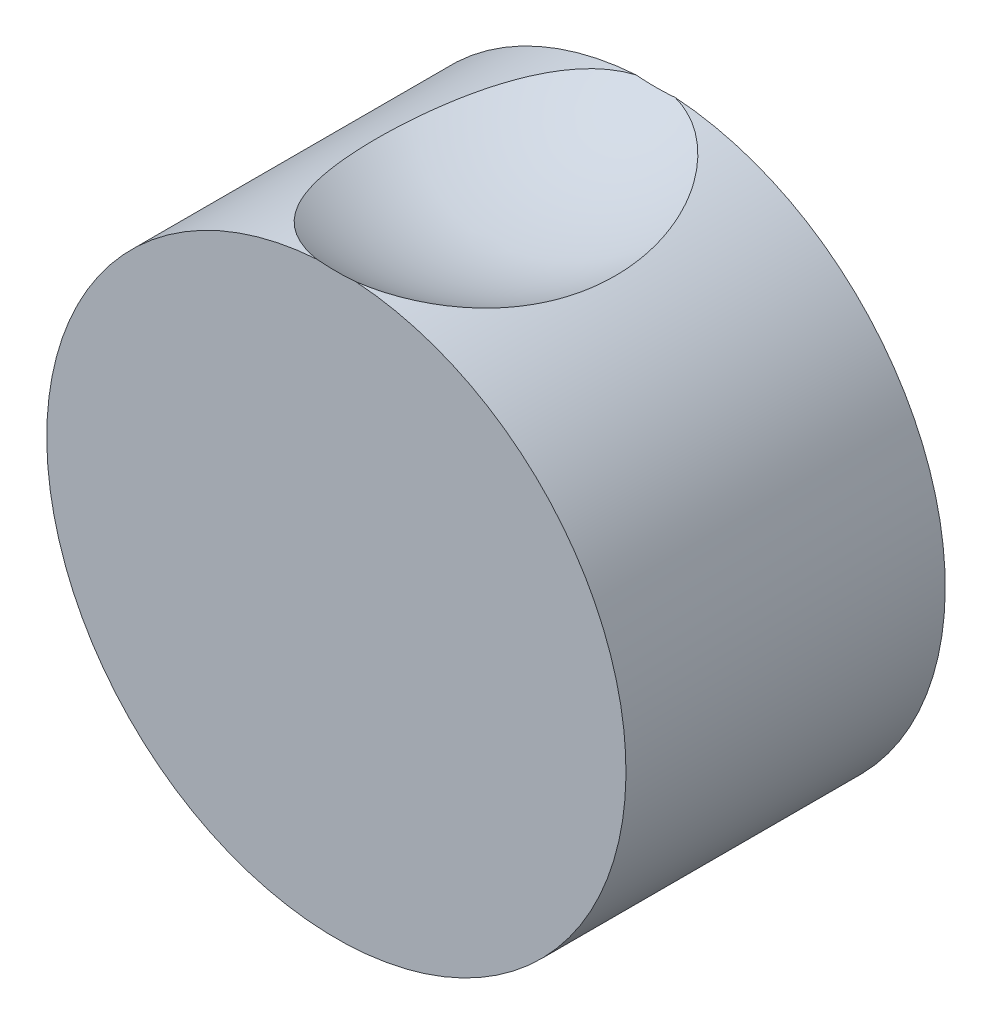
ISO-10303-21;
HEADER;
FILE_DESCRIPTION(('STEP AP214'),'2;1');
FILE_NAME('part.step','',(''),(''),'','','');
FILE_SCHEMA(('AUTOMOTIVE_DESIGN { 1 0 10303 214 1 1 1 1 }'));
ENDSEC;
DATA;
#1=APPLICATION_CONTEXT('core data for automotive mechanical design processes');
#2=APPLICATION_PROTOCOL_DEFINITION('international standard','automotive_design',2000,#1);
#3=PRODUCT_CONTEXT('',#1,'mechanical');
#4=PRODUCT('Part','Part','',(#3));
#5=PRODUCT_RELATED_PRODUCT_CATEGORY('part','',(#4));
#6=PRODUCT_DEFINITION_FORMATION('','',#4);
#7=PRODUCT_DEFINITION_CONTEXT('part definition',#1,'design');
#8=PRODUCT_DEFINITION('design','',#6,#7);
#9=PRODUCT_DEFINITION_SHAPE('','',#8);
#10=(LENGTH_UNIT() NAMED_UNIT(*) SI_UNIT(.MILLI.,.METRE.));
#11=(NAMED_UNIT(*) PLANE_ANGLE_UNIT() SI_UNIT($,.RADIAN.));
#12=(NAMED_UNIT(*) SI_UNIT($,.STERADIAN.) SOLID_ANGLE_UNIT());
#13=UNCERTAINTY_MEASURE_WITH_UNIT(LENGTH_MEASURE(1.E-05),#10,'distance_accuracy_value','');
#14=(GEOMETRIC_REPRESENTATION_CONTEXT(3) GLOBAL_UNCERTAINTY_ASSIGNED_CONTEXT((#13)) GLOBAL_UNIT_ASSIGNED_CONTEXT((#10,
#11,#12)) REPRESENTATION_CONTEXT('',''));
#15=CARTESIAN_POINT('',(0.,0.,0.));
#16=DIRECTION('',(0.,0.,1.));
#17=DIRECTION('',(1.,0.,0.));
#18=AXIS2_PLACEMENT_3D('',#15,#16,#17);
#19=CARTESIAN_POINT('',(0.,0.,7.));
#20=DIRECTION('',(0.,0.,-1.));
#21=DIRECTION('',(-1.,0.,0.));
#22=AXIS2_PLACEMENT_3D('',#19,#20,#21);
#23=CYLINDRICAL_SURFACE('',#22,12.7);
#24=CARTESIAN_POINT('',(0.853413033369814,12.6712937853431,7.00019999999999));
#25=CARTESIAN_POINT('',(0.975880962770479,12.663060223234,6.97385822513971));
#26=CARTESIAN_POINT('',(1.09697379572959,12.6531068999187,6.94190579288073));
#27=CARTESIAN_POINT('',(1.33546217603437,12.6301534807945,6.86751522871912));
#28=CARTESIAN_POINT('',(1.45286153320933,12.6171566496221,6.82508832968643));
#29=CARTESIAN_POINT('',(1.68234570048405,12.5886061041658,6.7308094191119));
#30=CARTESIAN_POINT('',(1.79446591512479,12.5730740014627,6.67903671039075));
#31=CARTESIAN_POINT('',(2.01382640204049,12.5398093382403,6.56662705212642));
#32=CARTESIAN_POINT('',(2.12106544611449,12.5220762280406,6.50598788759607));
#33=CARTESIAN_POINT('',(2.43384257146091,12.4663977945313,6.31252575460248));
#34=CARTESIAN_POINT('',(2.63158871432231,12.4258229932792,6.16767452429905));
#35=CARTESIAN_POINT('',(3.00445027897557,12.3409907969191,5.85175790431753));
#36=CARTESIAN_POINT('',(3.179509365817,12.2967246669028,5.68062948075666));
#37=CARTESIAN_POINT('',(3.46644312173592,12.2184346805265,5.36201787159332));
#38=CARTESIAN_POINT('',(3.58331758822438,12.1845445220677,5.21893976193113));
#39=CARTESIAN_POINT('',(3.80402464735603,12.1174548751567,4.92283634669832));
#40=CARTESIAN_POINT('',(3.90785225234736,12.0842556548639,4.76980727071751));
#41=CARTESIAN_POINT('',(4.1028781655804,12.019441119545,4.45533051125369));
#42=CARTESIAN_POINT('',(4.19405949406466,11.9878279697266,4.29387190225461));
#43=CARTESIAN_POINT('',(4.3640585537533,11.9269920270341,3.96412618129433));
#44=CARTESIAN_POINT('',(4.44287355933134,11.8977697618055,3.79583757421148));
#45=CARTESIAN_POINT('',(4.60812283902694,11.8349063363698,3.40768468488414));
#46=CARTESIAN_POINT('',(4.69091248653942,11.80218814656,3.18611408803591));
#47=CARTESIAN_POINT('',(4.83801969983405,11.7426510200737,2.7361399745645));
#48=CARTESIAN_POINT('',(4.90233251306093,11.7158336015902,2.50773471660179));
#49=CARTESIAN_POINT('',(5.0131238059389,11.6688563896393,2.04596839770438));
#50=CARTESIAN_POINT('',(5.05960117182612,11.6486970119552,1.81260702823714));
#51=CARTESIAN_POINT('',(5.13520220811278,11.6155670865843,1.34261725993032));
#52=CARTESIAN_POINT('',(5.16432704847023,11.6025960542424,1.10598908244941));
#53=CARTESIAN_POINT('',(5.20574161297231,11.5840741684374,0.628681875644523));
#54=CARTESIAN_POINT('',(5.21786662692763,11.5785959244002,0.387985777502206));
#55=CARTESIAN_POINT('',(5.22488844316189,11.5754289211117,-0.0937115183371887));
#56=CARTESIAN_POINT('',(5.21978489290249,11.5777403212555,-0.334712722176601));
#57=CARTESIAN_POINT('',(5.19227795119111,11.5901026369185,-0.815775451779264));
#58=CARTESIAN_POINT('',(5.16985719869822,11.600161319304,-1.05583579140774));
#59=CARTESIAN_POINT('',(5.10744708752495,11.627774805297,-1.53323468325088));
#60=CARTESIAN_POINT('',(5.06745752967056,11.6453296938874,-1.77057320457754));
#61=CARTESIAN_POINT('',(4.966153717501,11.6889082498784,-2.25681943524558));
#62=CARTESIAN_POINT('',(4.9035794120481,11.715424661567,-2.50542303585461));
#63=CARTESIAN_POINT('',(4.75713593774373,11.7756497910834,-2.99548291010005));
#64=CARTESIAN_POINT('',(4.67326139371222,11.8093603240262,-3.23693736242823));
#65=CARTESIAN_POINT('',(4.48347265767577,11.8827105335744,-3.70954196590346));
#66=CARTESIAN_POINT('',(4.37760615159514,11.9223373302927,-3.94071311917056));
#67=CARTESIAN_POINT('',(4.14276476598185,12.0059572069204,-4.39000117799037));
#68=CARTESIAN_POINT('',(4.01380719582361,12.0499470053211,-4.60812769970416));
#69=CARTESIAN_POINT('',(3.70326631473003,12.1493855057666,-5.07001286536869));
#70=CARTESIAN_POINT('',(3.51631522483006,12.2053600573774,-5.31010945917735));
#71=CARTESIAN_POINT('',(3.10642667929083,12.3160446770572,-5.75773750129825));
#72=CARTESIAN_POINT('',(2.88353385053309,12.3707562182553,-5.96530871239331));
#73=CARTESIAN_POINT('',(2.44883019867786,12.4632547844685,-6.30186691577556));
#74=CARTESIAN_POINT('',(2.24305481318258,12.5022773433864,-6.43829087407993));
#75=CARTESIAN_POINT('',(1.81127291737689,12.5720607035501,-6.67647007901353));
#76=CARTESIAN_POINT('',(1.58532208482883,12.6028433586276,-6.77831722673813));
#77=CARTESIAN_POINT('',(1.27050622417183,12.6365575224988,-6.88830621774038));
#78=CARTESIAN_POINT('',(1.1881589151995,12.6445742215673,-6.91428669960482));
#79=CARTESIAN_POINT('',(1.02190158289187,12.6590941409161,-6.96112584182555));
#80=CARTESIAN_POINT('',(0.937991752602842,12.6655975468383,-6.98198513043676));
#81=CARTESIAN_POINT('',(0.853413033369813,12.6712937853431,-7.00019999999999));
#82=B_SPLINE_CURVE_WITH_KNOTS('',3,(#24,#25,#26,#27,#28,#29,#30,#31,#32,#33,#34,#35,#36,#37,#38,
#39,#40,#41,#42,#43,#44,#45,#46,#47,#48,#49,#50,#51,#52,#53,#54,#55,#56,#57,#58,#59,#60,#61,#62,
#63,#64,#65,#66,#67,#68,#69,#70,#71,#72,#73,#74,#75,#76,#77,#78,#79,#80,#81),.UNSPECIFIED.,.F.,
.F.,(4,2,2,2,2,2,2,2,2,2,2,2,2,2,2,2,2,2,2,2,2,2,2,2,2,2,2,2,4),(0.,0.376398707718271,
0.752395503751768,1.12534019040398,1.4983782044884,2.24073366003073,2.98489853392775,
3.54765868286726,4.11063331766613,4.67435667086937,5.23820409873637,5.9535817593245,
6.66914326277848,7.38474944338026,8.10030737025999,8.8227514748524,9.54521036249812,
10.268394479561,10.9915867954284,11.7637234558238,12.5360551612156,13.3067293541206,
14.0768282394614,15.0017365709062,15.925505214301,16.6725754878738,17.4176442999313,
17.6776619853783,17.9376477565619),.UNSPECIFIED.);
#83=CARTESIAN_POINT('',(0.854341334188459,12.6712312300225,7.));
#84=VERTEX_POINT('',#83);
#85=CARTESIAN_POINT('',(0.854341334188478,12.6712312300225,-7.));
#86=VERTEX_POINT('',#85);
#87=EDGE_CURVE('E51',#84,#86,#82,.T.);
#88=ORIENTED_EDGE('',*,*,#87,.F.);
#89=CARTESIAN_POINT('',(0.,0.,7.));
#90=DIRECTION('',(0.,0.,1.));
#91=DIRECTION('',(1.,0.,0.));
#92=AXIS2_PLACEMENT_3D('',#89,#90,#91);
#93=CIRCLE('',#92,12.7);
#94=CARTESIAN_POINT('',(-0.854341334188452,12.6712312300225,7.));
#95=VERTEX_POINT('',#94);
#96=EDGE_CURVE('E45',#95,#84,#93,.T.);
#97=ORIENTED_EDGE('',*,*,#96,.F.);
#98=CARTESIAN_POINT('',(-0.853413033369788,12.6712937853431,-7.0002));
#99=CARTESIAN_POINT('',(-0.975880962770453,12.663060223234,-6.97385822513972));
#100=CARTESIAN_POINT('',(-1.09697379572956,12.6531068999187,-6.94190579288073));
#101=CARTESIAN_POINT('',(-1.33546217603434,12.6301534807945,-6.86751522871913));
#102=CARTESIAN_POINT('',(-1.4528615332093,12.6171566496221,-6.82508832968644));
#103=CARTESIAN_POINT('',(-1.68234570048402,12.5886061041658,-6.73080941911191));
#104=CARTESIAN_POINT('',(-1.79446591512476,12.5730740014627,-6.67903671039076));
#105=CARTESIAN_POINT('',(-2.01382640204046,12.5398093382403,-6.56662705212643));
#106=CARTESIAN_POINT('',(-2.12106544611446,12.5220762280406,-6.50598788759608));
#107=CARTESIAN_POINT('',(-2.43384257146088,12.4663977945313,-6.31252575460249));
#108=CARTESIAN_POINT('',(-2.63158871432229,12.4258229932792,-6.16767452429907));
#109=CARTESIAN_POINT('',(-3.00445027897554,12.3409907969191,-5.85175790431756));
#110=CARTESIAN_POINT('',(-3.17950936581698,12.2967246669028,-5.68062948075668));
#111=CARTESIAN_POINT('',(-3.46644312173589,12.2184346805265,-5.36201787159334));
#112=CARTESIAN_POINT('',(-3.58331758822435,12.1845445220677,-5.21893976193116));
#113=CARTESIAN_POINT('',(-3.80402464735601,12.1174548751567,-4.92283634669835));
#114=CARTESIAN_POINT('',(-3.90785225234734,12.0842556548639,-4.76980727071755));
#115=CARTESIAN_POINT('',(-4.10287816558037,12.019441119545,-4.45533051125373));
#116=CARTESIAN_POINT('',(-4.19405949406464,11.9878279697266,-4.29387190225465));
#117=CARTESIAN_POINT('',(-4.36405855375328,11.9269920270341,-3.96412618129437));
#118=CARTESIAN_POINT('',(-4.44287355933132,11.8977697618055,-3.79583757421152));
#119=CARTESIAN_POINT('',(-4.60812283902692,11.8349063363699,-3.40768468488418));
#120=CARTESIAN_POINT('',(-4.69091248653941,11.8021881465601,-3.18611408803596));
#121=CARTESIAN_POINT('',(-4.83801969983403,11.7426510200737,-2.73613997456455));
#122=CARTESIAN_POINT('',(-4.90233251306091,11.7158336015902,-2.50773471660183));
#123=CARTESIAN_POINT('',(-5.01312380593889,11.6688563896393,-2.04596839770443));
#124=CARTESIAN_POINT('',(-5.05960117182611,11.6486970119552,-1.81260702823719));
#125=CARTESIAN_POINT('',(-5.13520220811278,11.6155670865843,-1.34261725993038));
#126=CARTESIAN_POINT('',(-5.16432704847022,11.6025960542424,-1.10598908244947));
#127=CARTESIAN_POINT('',(-5.20574161297231,11.5840741684374,-0.628681875644579));
#128=CARTESIAN_POINT('',(-5.21786662692763,11.5785959244002,-0.387985777502263));
#129=CARTESIAN_POINT('',(-5.22488844316189,11.5754289211117,0.0937115183371308));
#130=CARTESIAN_POINT('',(-5.2197848929025,11.5777403212555,0.334712722176542));
#131=CARTESIAN_POINT('',(-5.19227795119112,11.5901026369185,0.815775451779204));
#132=CARTESIAN_POINT('',(-5.16985719869823,11.600161319304,1.05583579140768));
#133=CARTESIAN_POINT('',(-5.10744708752496,11.627774805297,1.53323468325082));
#134=CARTESIAN_POINT('',(-5.06745752967057,11.6453296938874,1.77057320457748));
#135=CARTESIAN_POINT('',(-4.96615371750102,11.6889082498784,2.25681943524552));
#136=CARTESIAN_POINT('',(-4.90357941204811,11.715424661567,2.50542303585455));
#137=CARTESIAN_POINT('',(-4.75713593774375,11.7756497910834,2.99548291009999));
#138=CARTESIAN_POINT('',(-4.67326139371224,11.8093603240262,3.23693736242817));
#139=CARTESIAN_POINT('',(-4.48347265767579,11.8827105335744,3.70954196590341));
#140=CARTESIAN_POINT('',(-4.37760615159517,11.9223373302927,3.9407131191705));
#141=CARTESIAN_POINT('',(-4.14276476598188,12.0059572069204,4.39000117799032));
#142=CARTESIAN_POINT('',(-4.01380719582364,12.0499470053211,4.60812769970411));
#143=CARTESIAN_POINT('',(-3.70326631473006,12.1493855057666,5.07001286536864));
#144=CARTESIAN_POINT('',(-3.5163152248301,12.2053600573774,5.3101094591773));
#145=CARTESIAN_POINT('',(-3.10642667929087,12.3160446770572,5.75773750129821));
#146=CARTESIAN_POINT('',(-2.88353385053313,12.3707562182553,5.96530871239328));
#147=CARTESIAN_POINT('',(-2.4488301986779,12.4632547844685,6.30186691577553));
#148=CARTESIAN_POINT('',(-2.24305481318262,12.5022773433864,6.4382908740799));
#149=CARTESIAN_POINT('',(-1.81127291737693,12.5720607035501,6.67647007901351));
#150=CARTESIAN_POINT('',(-1.58532208482888,12.6028433586276,6.77831722673811));
#151=CARTESIAN_POINT('',(-1.27050622417187,12.6365575224988,6.88830621774037));
#152=CARTESIAN_POINT('',(-1.18815891519952,12.6445742215673,6.91428669960481));
#153=CARTESIAN_POINT('',(-1.02190158289187,12.6590941409161,6.96112584182555));
#154=CARTESIAN_POINT('',(-0.937991752602828,12.6655975468383,6.98198513043677));
#155=CARTESIAN_POINT('',(-0.853413033369788,12.6712937853431,7.0002));
#156=B_SPLINE_CURVE_WITH_KNOTS('',3,(#98,#99,#100,#101,#102,#103,#104,#105,#106,#107,#108,#109,
#110,#111,#112,#113,#114,#115,#116,#117,#118,#119,#120,#121,#122,#123,#124,#125,#126,#127,#128,
#129,#130,#131,#132,#133,#134,#135,#136,#137,#138,#139,#140,#141,#142,#143,#144,#145,#146,#147,
#148,#149,#150,#151,#152,#153,#154,#155),.UNSPECIFIED.,.F.,.F.,(4,2,2,2,2,2,2,2,2,2,2,2,2,2,2,2,
2,2,2,2,2,2,2,2,2,2,2,2,4),(0.,0.37639870771827,0.752395503751765,1.12534019040397,
1.49837820448839,2.24073366003072,2.98489853392774,3.54765868286724,4.11063331766611,
4.67435667086935,5.23820409873634,5.95358175932448,6.66914326277846,7.38474944338024,
8.10030737025996,8.82275147485237,9.54521036249809,10.268394479561,10.9915867954284,
11.7637234558238,12.5360551612156,13.3067293541205,14.0768282394613,15.0017365709062,
15.9255052143009,16.6725754878738,17.4176442999313,17.6776619853783,17.937647756562),.UNSPECIFIED.);
#157=CARTESIAN_POINT('',(-0.854341334188478,12.6712312300225,-7.));
#158=VERTEX_POINT('',#157);
#159=EDGE_CURVE('E62',#158,#95,#156,.T.);
#160=ORIENTED_EDGE('',*,*,#159,.F.);
#161=CARTESIAN_POINT('',(0.,0.,-7.));
#162=DIRECTION('',(0.,0.,1.));
#163=DIRECTION('',(1.,0.,0.));
#164=AXIS2_PLACEMENT_3D('',#161,#162,#163);
#165=CIRCLE('',#164,12.7);
#166=EDGE_CURVE('E68',#158,#86,#165,.T.);
#167=ORIENTED_EDGE('',*,*,#166,.T.);
#168=EDGE_LOOP('',(#88,#97,#160,#167));
#169=FACE_BOUND('',#168,.T.);
#170=ADVANCED_FACE('F37',(#169),#23,.T.);
#171=CARTESIAN_POINT('',(0.,0.,7.));
#172=DIRECTION('',(0.,0.,1.));
#173=DIRECTION('',(1.,0.,0.));
#174=AXIS2_PLACEMENT_3D('',#171,#172,#173);
#175=PLANE('',#174);
#176=ORIENTED_EDGE('',*,*,#96,.T.);
#177=CARTESIAN_POINT('',(0.,22.3805103425363,7.));
#178=DIRECTION('',(0.,0.,1.));
#179=DIRECTION('',(1.,0.,0.));
#180=AXIS2_PLACEMENT_3D('',#177,#178,#179);
#181=CIRCLE('',#180,9.74679434480896);
#182=EDGE_CURVE('E56',#84,#95,#181,.F.);
#183=ORIENTED_EDGE('',*,*,#182,.T.);
#184=EDGE_LOOP('',(#176,#183));
#185=FACE_BOUND('',#184,.T.);
#186=ADVANCED_FACE('F87',(#185),#175,.T.);
#187=CARTESIAN_POINT('',(0.,0.,-7.));
#188=DIRECTION('',(0.,0.,1.));
#189=DIRECTION('',(1.,0.,0.));
#190=AXIS2_PLACEMENT_3D('',#187,#188,#189);
#191=PLANE('',#190);
#192=CARTESIAN_POINT('',(0.,22.3805103425363,-7.));
#193=DIRECTION('',(0.,0.,1.));
#194=DIRECTION('',(1.,0.,0.));
#195=AXIS2_PLACEMENT_3D('',#192,#193,#194);
#196=CIRCLE('',#195,9.74679434480896);
#197=EDGE_CURVE('E11',#86,#158,#196,.F.);
#198=ORIENTED_EDGE('',*,*,#197,.F.);
#199=ORIENTED_EDGE('',*,*,#166,.F.);
#200=EDGE_LOOP('',(#198,#199));
#201=FACE_BOUND('',#200,.T.);
#202=ADVANCED_FACE('F71',(#201),#191,.F.);
#203=CARTESIAN_POINT('',(0.,22.3805103425363,0.));
#204=DIRECTION('',(0.,1.,0.));
#205=DIRECTION('',(0.,0.,-1.));
#206=AXIS2_PLACEMENT_3D('',#203,#204,#205);
#207=SPHERICAL_SURFACE('',#206,12.);
#208=ORIENTED_EDGE('',*,*,#87,.T.);
#209=ORIENTED_EDGE('',*,*,#197,.T.);
#210=ORIENTED_EDGE('',*,*,#159,.T.);
#211=ORIENTED_EDGE('',*,*,#182,.F.);
#212=EDGE_LOOP('',(#208,#209,#210,#211));
#213=FACE_BOUND('',#212,.T.);
#214=ADVANCED_FACE('F61',(#213),#207,.F.);
#215=CLOSED_SHELL('',(#170,#186,#202,#214));
#216=MANIFOLD_SOLID_BREP('B2',#215);
#217=ADVANCED_BREP_SHAPE_REPRESENTATION('',(#18,#216),#14);
#218=SHAPE_DEFINITION_REPRESENTATION(#9,#217);
ENDSEC;
END-ISO-10303-21;
